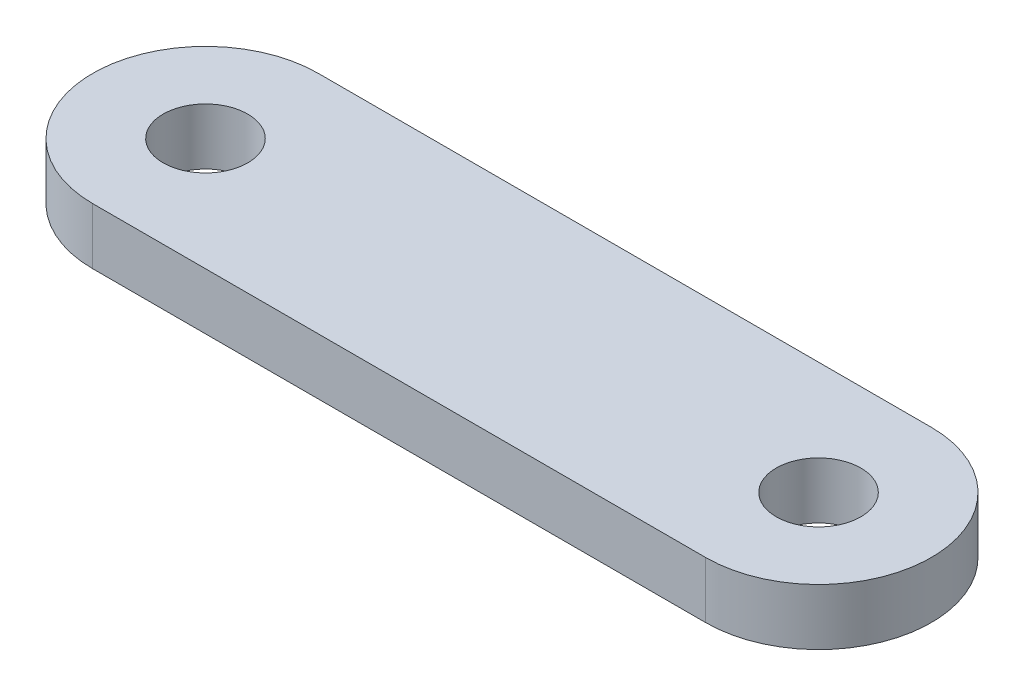
ISO-10303-21;
HEADER;
FILE_DESCRIPTION(('STEP AP214'),'2;1');
FILE_NAME('part.step','',(''),(''),'','','');
FILE_SCHEMA(('AUTOMOTIVE_DESIGN { 1 0 10303 214 1 1 1 1 }'));
ENDSEC;
DATA;
#1=APPLICATION_CONTEXT('core data for automotive mechanical design processes');
#2=APPLICATION_PROTOCOL_DEFINITION('international standard','automotive_design',2000,#1);
#3=PRODUCT_CONTEXT('',#1,'mechanical');
#4=PRODUCT('Part','Part','',(#3));
#5=PRODUCT_RELATED_PRODUCT_CATEGORY('part','',(#4));
#6=PRODUCT_DEFINITION_FORMATION('','',#4);
#7=PRODUCT_DEFINITION_CONTEXT('part definition',#1,'design');
#8=PRODUCT_DEFINITION('design','',#6,#7);
#9=PRODUCT_DEFINITION_SHAPE('','',#8);
#10=(LENGTH_UNIT() NAMED_UNIT(*) SI_UNIT(.MILLI.,.METRE.));
#11=(NAMED_UNIT(*) PLANE_ANGLE_UNIT() SI_UNIT($,.RADIAN.));
#12=(NAMED_UNIT(*) SI_UNIT($,.STERADIAN.) SOLID_ANGLE_UNIT());
#13=UNCERTAINTY_MEASURE_WITH_UNIT(LENGTH_MEASURE(1.E-05),#10,'distance_accuracy_value','');
#14=(GEOMETRIC_REPRESENTATION_CONTEXT(3) GLOBAL_UNCERTAINTY_ASSIGNED_CONTEXT((#13)) GLOBAL_UNIT_ASSIGNED_CONTEXT((#10,
#11,#12)) REPRESENTATION_CONTEXT('',''));
#15=CARTESIAN_POINT('',(0.,0.,0.));
#16=DIRECTION('',(0.,0.,1.));
#17=DIRECTION('',(1.,0.,0.));
#18=AXIS2_PLACEMENT_3D('',#15,#16,#17);
#19=CARTESIAN_POINT('',(-13.8049,2.54,0.));
#20=DIRECTION('',(0.,1.,0.));
#21=DIRECTION('',(0.,0.,1.));
#22=AXIS2_PLACEMENT_3D('',#19,#20,#21);
#23=PLANE('',#22);
#24=CARTESIAN_POINT('',(-13.8049,2.54,0.));
#25=DIRECTION('',(0.,1.,0.));
#26=DIRECTION('',(0.,0.,1.));
#27=AXIS2_PLACEMENT_3D('',#24,#25,#26);
#28=CIRCLE('',#27,1.905);
#29=CARTESIAN_POINT('',(-13.8049,2.54,1.905));
#30=VERTEX_POINT('',#29);
#31=EDGE_CURVE('E99',#30,#30,#28,.T.);
#32=ORIENTED_EDGE('',*,*,#31,.F.);
#33=EDGE_LOOP('',(#32));
#34=FACE_BOUND('',#33,.T.);
#35=CARTESIAN_POINT('',(-13.8049,2.54,0.));
#36=DIRECTION('',(0.,1.,0.));
#37=DIRECTION('',(0.,0.,1.));
#38=AXIS2_PLACEMENT_3D('',#35,#36,#37);
#39=CIRCLE('',#38,5.08);
#40=CARTESIAN_POINT('',(-13.8049,2.54,-5.08));
#41=VERTEX_POINT('',#40);
#42=CARTESIAN_POINT('',(-13.8049,2.54,5.08));
#43=VERTEX_POINT('',#42);
#44=EDGE_CURVE('E84',#41,#43,#39,.T.);
#45=ORIENTED_EDGE('',*,*,#44,.T.);
#46=DIRECTION('',(1.,0.,0.));
#47=VECTOR('',#46,1.);
#48=CARTESIAN_POINT('',(-13.8049,2.54,5.08));
#49=LINE('',#48,#47);
#50=CARTESIAN_POINT('',(13.8049,2.54,5.08));
#51=VERTEX_POINT('',#50);
#52=EDGE_CURVE('E79',#43,#51,#49,.T.);
#53=ORIENTED_EDGE('',*,*,#52,.T.);
#54=CARTESIAN_POINT('',(13.8049,2.54,0.));
#55=DIRECTION('',(0.,1.,0.));
#56=DIRECTION('',(0.,0.,1.));
#57=AXIS2_PLACEMENT_3D('',#54,#55,#56);
#58=CIRCLE('',#57,5.08);
#59=CARTESIAN_POINT('',(13.8049,2.54,-5.08000000000001));
#60=VERTEX_POINT('',#59);
#61=EDGE_CURVE('E82',#51,#60,#58,.T.);
#62=ORIENTED_EDGE('',*,*,#61,.T.);
#63=DIRECTION('',(-1.,0.,0.));
#64=VECTOR('',#63,1.);
#65=CARTESIAN_POINT('',(-13.8049,2.54,-5.08));
#66=LINE('',#65,#64);
#67=EDGE_CURVE('E49',#60,#41,#66,.T.);
#68=ORIENTED_EDGE('',*,*,#67,.T.);
#69=EDGE_LOOP('',(#45,#53,#62,#68));
#70=FACE_BOUND('',#69,.T.);
#71=CARTESIAN_POINT('',(13.8049,2.54,0.));
#72=DIRECTION('',(0.,1.,0.));
#73=DIRECTION('',(0.,0.,1.));
#74=AXIS2_PLACEMENT_3D('',#71,#72,#73);
#75=CIRCLE('',#74,1.905);
#76=CARTESIAN_POINT('',(13.8049,2.54,1.905));
#77=VERTEX_POINT('',#76);
#78=EDGE_CURVE('E114',#77,#77,#75,.T.);
#79=ORIENTED_EDGE('',*,*,#78,.F.);
#80=EDGE_LOOP('',(#79));
#81=FACE_BOUND('',#80,.T.);
#82=ADVANCED_FACE('F32',(#34,#70,#81),#23,.T.);
#83=CARTESIAN_POINT('',(-13.8049,0.,0.));
#84=DIRECTION('',(0.,1.,0.));
#85=DIRECTION('',(0.,0.,1.));
#86=AXIS2_PLACEMENT_3D('',#83,#84,#85);
#87=PLANE('',#86);
#88=CARTESIAN_POINT('',(-13.8049,0.,0.));
#89=DIRECTION('',(0.,1.,0.));
#90=DIRECTION('',(0.,0.,1.));
#91=AXIS2_PLACEMENT_3D('',#88,#89,#90);
#92=CIRCLE('',#91,5.08);
#93=CARTESIAN_POINT('',(-13.8049,0.,-5.08));
#94=VERTEX_POINT('',#93);
#95=CARTESIAN_POINT('',(-13.8049,0.,5.08));
#96=VERTEX_POINT('',#95);
#97=EDGE_CURVE('E96',#94,#96,#92,.T.);
#98=ORIENTED_EDGE('',*,*,#97,.F.);
#99=DIRECTION('',(-1.,0.,0.));
#100=VECTOR('',#99,1.);
#101=CARTESIAN_POINT('',(-13.8049,0.,-5.08));
#102=LINE('',#101,#100);
#103=CARTESIAN_POINT('',(13.8049,0.,-5.08000000000001));
#104=VERTEX_POINT('',#103);
#105=EDGE_CURVE('E72',#104,#94,#102,.T.);
#106=ORIENTED_EDGE('',*,*,#105,.F.);
#107=CARTESIAN_POINT('',(13.8049,0.,0.));
#108=DIRECTION('',(0.,1.,0.));
#109=DIRECTION('',(0.,0.,1.));
#110=AXIS2_PLACEMENT_3D('',#107,#108,#109);
#111=CIRCLE('',#110,5.08);
#112=CARTESIAN_POINT('',(13.8049,0.,5.08));
#113=VERTEX_POINT('',#112);
#114=EDGE_CURVE('E66',#113,#104,#111,.T.);
#115=ORIENTED_EDGE('',*,*,#114,.F.);
#116=DIRECTION('',(1.,0.,0.));
#117=VECTOR('',#116,1.);
#118=CARTESIAN_POINT('',(-13.8049,0.,5.08));
#119=LINE('',#118,#117);
#120=EDGE_CURVE('E88',#96,#113,#119,.T.);
#121=ORIENTED_EDGE('',*,*,#120,.F.);
#122=EDGE_LOOP('',(#98,#106,#115,#121));
#123=FACE_BOUND('',#122,.T.);
#124=CARTESIAN_POINT('',(-13.8049,0.,0.));
#125=DIRECTION('',(0.,1.,0.));
#126=DIRECTION('',(0.,0.,1.));
#127=AXIS2_PLACEMENT_3D('',#124,#125,#126);
#128=CIRCLE('',#127,1.905);
#129=CARTESIAN_POINT('',(-13.8049,0.,1.905));
#130=VERTEX_POINT('',#129);
#131=EDGE_CURVE('E111',#130,#130,#128,.T.);
#132=ORIENTED_EDGE('',*,*,#131,.T.);
#133=EDGE_LOOP('',(#132));
#134=FACE_BOUND('',#133,.T.);
#135=CARTESIAN_POINT('',(13.8049,0.,0.));
#136=DIRECTION('',(0.,1.,0.));
#137=DIRECTION('',(0.,0.,1.));
#138=AXIS2_PLACEMENT_3D('',#135,#136,#137);
#139=CIRCLE('',#138,1.905);
#140=CARTESIAN_POINT('',(13.8049,0.,1.905));
#141=VERTEX_POINT('',#140);
#142=EDGE_CURVE('E117',#141,#141,#139,.T.);
#143=ORIENTED_EDGE('',*,*,#142,.T.);
#144=EDGE_LOOP('',(#143));
#145=FACE_BOUND('',#144,.T.);
#146=ADVANCED_FACE('F107',(#123,#134,#145),#87,.F.);
#147=CARTESIAN_POINT('',(-13.8049,2.54,0.));
#148=DIRECTION('',(0.,-1.,0.));
#149=DIRECTION('',(0.,0.,-1.));
#150=AXIS2_PLACEMENT_3D('',#147,#148,#149);
#151=CYLINDRICAL_SURFACE('',#150,5.08);
#152=ORIENTED_EDGE('',*,*,#97,.T.);
#153=DIRECTION('',(0.,-1.,0.));
#154=VECTOR('',#153,1.);
#155=CARTESIAN_POINT('',(-13.8049,2.54,5.08));
#156=LINE('',#155,#154);
#157=EDGE_CURVE('E11',#43,#96,#156,.T.);
#158=ORIENTED_EDGE('',*,*,#157,.F.);
#159=ORIENTED_EDGE('',*,*,#44,.F.);
#160=DIRECTION('',(0.,-1.,0.));
#161=VECTOR('',#160,1.);
#162=CARTESIAN_POINT('',(-13.8049,2.54,-5.08));
#163=LINE('',#162,#161);
#164=EDGE_CURVE('E92',#41,#94,#163,.T.);
#165=ORIENTED_EDGE('',*,*,#164,.T.);
#166=EDGE_LOOP('',(#152,#158,#159,#165));
#167=FACE_BOUND('',#166,.T.);
#168=ADVANCED_FACE('F34',(#167),#151,.T.);
#169=CARTESIAN_POINT('',(-13.8049,2.54,5.08));
#170=DIRECTION('',(0.,0.,-1.));
#171=DIRECTION('',(-1.,0.,0.));
#172=AXIS2_PLACEMENT_3D('',#169,#170,#171);
#173=PLANE('',#172);
#174=ORIENTED_EDGE('',*,*,#120,.T.);
#175=DIRECTION('',(0.,-1.,0.));
#176=VECTOR('',#175,1.);
#177=CARTESIAN_POINT('',(13.8049,2.54,5.08));
#178=LINE('',#177,#176);
#179=EDGE_CURVE('E41',#51,#113,#178,.T.);
#180=ORIENTED_EDGE('',*,*,#179,.F.);
#181=ORIENTED_EDGE('',*,*,#52,.F.);
#182=ORIENTED_EDGE('',*,*,#157,.T.);
#183=EDGE_LOOP('',(#174,#180,#181,#182));
#184=FACE_BOUND('',#183,.T.);
#185=ADVANCED_FACE('F87',(#184),#173,.F.);
#186=CARTESIAN_POINT('',(13.8049,2.54,0.));
#187=DIRECTION('',(0.,-1.,0.));
#188=DIRECTION('',(0.,0.,-1.));
#189=AXIS2_PLACEMENT_3D('',#186,#187,#188);
#190=CYLINDRICAL_SURFACE('',#189,5.08);
#191=ORIENTED_EDGE('',*,*,#114,.T.);
#192=DIRECTION('',(0.,-1.,0.));
#193=VECTOR('',#192,1.);
#194=CARTESIAN_POINT('',(13.8049,2.54,-5.08000000000001));
#195=LINE('',#194,#193);
#196=EDGE_CURVE('E89',#60,#104,#195,.T.);
#197=ORIENTED_EDGE('',*,*,#196,.F.);
#198=ORIENTED_EDGE('',*,*,#61,.F.);
#199=ORIENTED_EDGE('',*,*,#179,.T.);
#200=EDGE_LOOP('',(#191,#197,#198,#199));
#201=FACE_BOUND('',#200,.T.);
#202=ADVANCED_FACE('F90',(#201),#190,.T.);
#203=CARTESIAN_POINT('',(-13.8049,2.54,-5.08));
#204=DIRECTION('',(0.,0.,1.));
#205=DIRECTION('',(1.,0.,0.));
#206=AXIS2_PLACEMENT_3D('',#203,#204,#205);
#207=PLANE('',#206);
#208=ORIENTED_EDGE('',*,*,#105,.T.);
#209=ORIENTED_EDGE('',*,*,#164,.F.);
#210=ORIENTED_EDGE('',*,*,#67,.F.);
#211=ORIENTED_EDGE('',*,*,#196,.T.);
#212=EDGE_LOOP('',(#208,#209,#210,#211));
#213=FACE_BOUND('',#212,.T.);
#214=ADVANCED_FACE('F104',(#213),#207,.F.);
#215=CARTESIAN_POINT('',(-13.8049,2.54,0.));
#216=DIRECTION('',(0.,-1.,0.));
#217=DIRECTION('',(0.,0.,-1.));
#218=AXIS2_PLACEMENT_3D('',#215,#216,#217);
#219=CYLINDRICAL_SURFACE('',#218,1.905);
#220=ORIENTED_EDGE('',*,*,#31,.T.);
#221=EDGE_LOOP('',(#220));
#222=FACE_BOUND('',#221,.T.);
#223=ORIENTED_EDGE('',*,*,#131,.F.);
#224=EDGE_LOOP('',(#223));
#225=FACE_BOUND('',#224,.T.);
#226=ADVANCED_FACE('F134',(#222,#225),#219,.F.);
#227=CARTESIAN_POINT('',(13.8049,2.54,0.));
#228=DIRECTION('',(0.,-1.,0.));
#229=DIRECTION('',(0.,0.,-1.));
#230=AXIS2_PLACEMENT_3D('',#227,#228,#229);
#231=CYLINDRICAL_SURFACE('',#230,1.905);
#232=ORIENTED_EDGE('',*,*,#78,.T.);
#233=EDGE_LOOP('',(#232));
#234=FACE_BOUND('',#233,.T.);
#235=ORIENTED_EDGE('',*,*,#142,.F.);
#236=EDGE_LOOP('',(#235));
#237=FACE_BOUND('',#236,.T.);
#238=ADVANCED_FACE('F123',(#234,#237),#231,.F.);
#239=CLOSED_SHELL('',(#82,#146,#168,#185,#202,#214,#226,#238));
#240=MANIFOLD_SOLID_BREP('B2',#239);
#241=ADVANCED_BREP_SHAPE_REPRESENTATION('',(#18,#240),#14);
#242=SHAPE_DEFINITION_REPRESENTATION(#9,#241);
ENDSEC;
END-ISO-10303-21;
